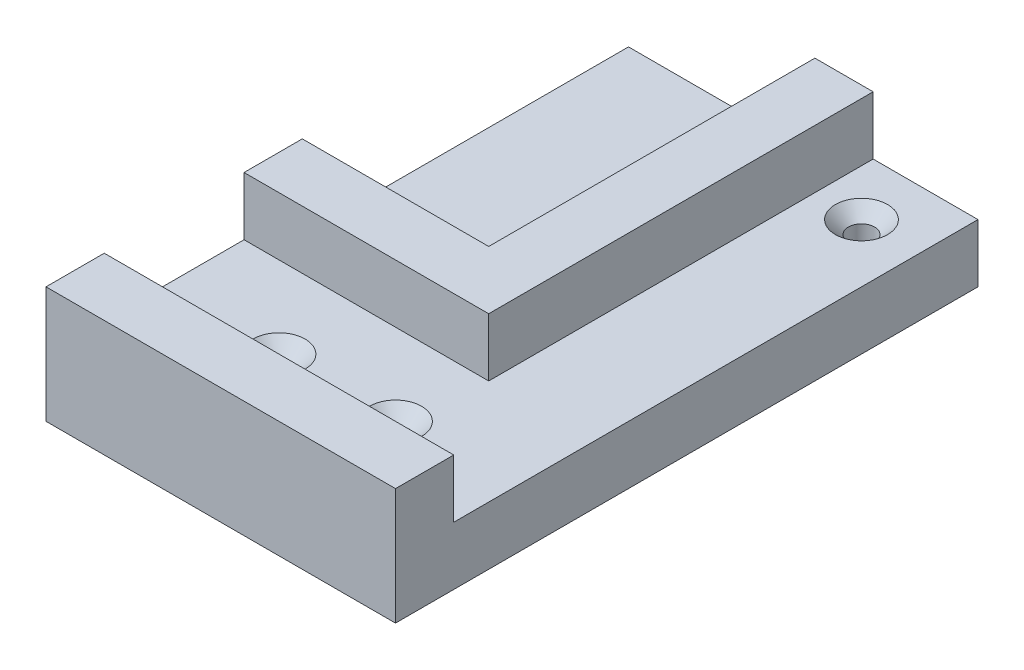
ISO-10303-21;
HEADER;
FILE_DESCRIPTION(('STEP AP214'),'2;1');
FILE_NAME('part.step','',(''),(''),'','','');
FILE_SCHEMA(('AUTOMOTIVE_DESIGN { 1 0 10303 214 1 1 1 1 }'));
ENDSEC;
DATA;
#1=APPLICATION_CONTEXT('core data for automotive mechanical design processes');
#2=APPLICATION_PROTOCOL_DEFINITION('international standard','automotive_design',2000,#1);
#3=PRODUCT_CONTEXT('',#1,'mechanical');
#4=PRODUCT('Part','Part','',(#3));
#5=PRODUCT_RELATED_PRODUCT_CATEGORY('part','',(#4));
#6=PRODUCT_DEFINITION_FORMATION('','',#4);
#7=PRODUCT_DEFINITION_CONTEXT('part definition',#1,'design');
#8=PRODUCT_DEFINITION('design','',#6,#7);
#9=PRODUCT_DEFINITION_SHAPE('','',#8);
#10=(LENGTH_UNIT() NAMED_UNIT(*) SI_UNIT(.MILLI.,.METRE.));
#11=(NAMED_UNIT(*) PLANE_ANGLE_UNIT() SI_UNIT($,.RADIAN.));
#12=(NAMED_UNIT(*) SI_UNIT($,.STERADIAN.) SOLID_ANGLE_UNIT());
#13=UNCERTAINTY_MEASURE_WITH_UNIT(LENGTH_MEASURE(1.E-05),#10,'distance_accuracy_value','');
#14=(GEOMETRIC_REPRESENTATION_CONTEXT(3) GLOBAL_UNCERTAINTY_ASSIGNED_CONTEXT((#13)) GLOBAL_UNIT_ASSIGNED_CONTEXT((#10,
#11,#12)) REPRESENTATION_CONTEXT('',''));
#15=CARTESIAN_POINT('',(0.,0.,0.));
#16=DIRECTION('',(0.,0.,1.));
#17=DIRECTION('',(1.,0.,0.));
#18=AXIS2_PLACEMENT_3D('',#15,#16,#17);
#19=CARTESIAN_POINT('',(-30.,20.,50.));
#20=DIRECTION('',(1.,0.,0.));
#21=DIRECTION('',(0.,0.,-1.));
#22=AXIS2_PLACEMENT_3D('',#19,#20,#21);
#23=PLANE('',#22);
#24=DIRECTION('',(0.,1.,0.));
#25=VECTOR('',#24,1.);
#26=CARTESIAN_POINT('',(-30.,10.,16.));
#27=LINE('',#26,#25);
#28=CARTESIAN_POINT('',(-30.,10.,16.));
#29=VERTEX_POINT('',#28);
#30=CARTESIAN_POINT('',(-30.,20.,16.));
#31=VERTEX_POINT('',#30);
#32=EDGE_CURVE('E180',#29,#31,#27,.T.);
#33=ORIENTED_EDGE('',*,*,#32,.T.);
#34=DIRECTION('',(0.,0.,1.));
#35=VECTOR('',#34,1.);
#36=CARTESIAN_POINT('',(-30.,20.,50.));
#37=LINE('',#36,#35);
#38=CARTESIAN_POINT('',(-30.,20.,6.));
#39=VERTEX_POINT('',#38);
#40=EDGE_CURVE('E202',#39,#31,#37,.T.);
#41=ORIENTED_EDGE('',*,*,#40,.F.);
#42=DIRECTION('',(0.,1.,0.));
#43=VECTOR('',#42,1.);
#44=CARTESIAN_POINT('',(-30.,5.675,6.));
#45=LINE('',#44,#43);
#46=CARTESIAN_POINT('',(-30.,5.675,6.));
#47=VERTEX_POINT('',#46);
#48=EDGE_CURVE('E63',#47,#39,#45,.T.);
#49=ORIENTED_EDGE('',*,*,#48,.F.);
#50=DIRECTION('',(0.,0.,1.));
#51=VECTOR('',#50,1.);
#52=CARTESIAN_POINT('',(-30.,5.675,-50.));
#53=LINE('',#52,#51);
#54=CARTESIAN_POINT('',(-30.,5.675,-50.));
#55=VERTEX_POINT('',#54);
#56=EDGE_CURVE('E161',#55,#47,#53,.T.);
#57=ORIENTED_EDGE('',*,*,#56,.F.);
#58=DIRECTION('',(0.,-1.,0.));
#59=VECTOR('',#58,1.);
#60=CARTESIAN_POINT('',(-30.,20.,-50.));
#61=LINE('',#60,#59);
#62=CARTESIAN_POINT('',(-30.,0.,-50.));
#63=VERTEX_POINT('',#62);
#64=EDGE_CURVE('E48',#55,#63,#61,.T.);
#65=ORIENTED_EDGE('',*,*,#64,.T.);
#66=DIRECTION('',(0.,0.,1.));
#67=VECTOR('',#66,1.);
#68=CARTESIAN_POINT('',(-30.,0.,50.));
#69=LINE('',#68,#67);
#70=CARTESIAN_POINT('',(-30.,0.,50.));
#71=VERTEX_POINT('',#70);
#72=EDGE_CURVE('E217',#63,#71,#69,.T.);
#73=ORIENTED_EDGE('',*,*,#72,.T.);
#74=DIRECTION('',(0.,-1.,0.));
#75=VECTOR('',#74,1.);
#76=CARTESIAN_POINT('',(-30.,20.,50.));
#77=LINE('',#76,#75);
#78=CARTESIAN_POINT('',(-30.,20.,50.));
#79=VERTEX_POINT('',#78);
#80=EDGE_CURVE('E225',#79,#71,#77,.T.);
#81=ORIENTED_EDGE('',*,*,#80,.F.);
#82=CARTESIAN_POINT('',(-30.,20.,40.));
#83=VERTEX_POINT('',#82);
#84=EDGE_CURVE('E150',#83,#79,#37,.T.);
#85=ORIENTED_EDGE('',*,*,#84,.F.);
#86=DIRECTION('',(0.,1.,0.));
#87=VECTOR('',#86,1.);
#88=CARTESIAN_POINT('',(-30.,10.,40.));
#89=LINE('',#88,#87);
#90=CARTESIAN_POINT('',(-30.,10.,40.));
#91=VERTEX_POINT('',#90);
#92=EDGE_CURVE('E55',#91,#83,#89,.T.);
#93=ORIENTED_EDGE('',*,*,#92,.F.);
#94=DIRECTION('',(0.,0.,1.));
#95=VECTOR('',#94,1.);
#96=CARTESIAN_POINT('',(-30.,10.,0.));
#97=LINE('',#96,#95);
#98=EDGE_CURVE('E136',#29,#91,#97,.T.);
#99=ORIENTED_EDGE('',*,*,#98,.F.);
#100=EDGE_LOOP('',(#33,#41,#49,#57,#65,#73,#81,#85,#93,#99));
#101=FACE_BOUND('',#100,.T.);
#102=ADVANCED_FACE('F39',(#101),#23,.F.);
#103=CARTESIAN_POINT('',(0.,20.,0.));
#104=DIRECTION('',(0.,-1.,0.));
#105=DIRECTION('',(0.,0.,-1.));
#106=AXIS2_PLACEMENT_3D('',#103,#104,#105);
#107=PLANE('',#106);
#108=DIRECTION('',(1.,0.,0.));
#109=VECTOR('',#108,1.);
#110=CARTESIAN_POINT('',(0.,20.,16.));
#111=LINE('',#110,#109);
#112=CARTESIAN_POINT('',(12.,20.,16.));
#113=VERTEX_POINT('',#112);
#114=EDGE_CURVE('E146',#31,#113,#111,.T.);
#115=ORIENTED_EDGE('',*,*,#114,.T.);
#116=DIRECTION('',(0.,0.,1.));
#117=VECTOR('',#116,1.);
#118=CARTESIAN_POINT('',(12.,20.,0.));
#119=LINE('',#118,#117);
#120=CARTESIAN_POINT('',(12.,20.,-50.));
#121=VERTEX_POINT('',#120);
#122=EDGE_CURVE('E267',#121,#113,#119,.T.);
#123=ORIENTED_EDGE('',*,*,#122,.F.);
#124=DIRECTION('',(-1.,0.,0.));
#125=VECTOR('',#124,1.);
#126=CARTESIAN_POINT('',(-30.,20.,-50.));
#127=LINE('',#126,#125);
#128=CARTESIAN_POINT('',(2.,20.,-50.));
#129=VERTEX_POINT('',#128);
#130=EDGE_CURVE('E198',#121,#129,#127,.T.);
#131=ORIENTED_EDGE('',*,*,#130,.T.);
#132=DIRECTION('',(0.,0.,-1.));
#133=VECTOR('',#132,1.);
#134=CARTESIAN_POINT('',(2.,20.,-50.));
#135=LINE('',#134,#133);
#136=CARTESIAN_POINT('',(2.00000000000001,20.,6.));
#137=VERTEX_POINT('',#136);
#138=EDGE_CURVE('E166',#137,#129,#135,.T.);
#139=ORIENTED_EDGE('',*,*,#138,.F.);
#140=DIRECTION('',(1.,0.,0.));
#141=VECTOR('',#140,1.);
#142=CARTESIAN_POINT('',(-30.,20.,6.));
#143=LINE('',#142,#141);
#144=EDGE_CURVE('E177',#39,#137,#143,.T.);
#145=ORIENTED_EDGE('',*,*,#144,.F.);
#146=ORIENTED_EDGE('',*,*,#40,.T.);
#147=EDGE_LOOP('',(#115,#123,#131,#139,#145,#146));
#148=FACE_BOUND('',#147,.T.);
#149=ADVANCED_FACE('F343',(#148),#107,.F.);
#150=CARTESIAN_POINT('',(30.,20.,50.));
#151=DIRECTION('',(-1.,0.,0.));
#152=DIRECTION('',(0.,0.,1.));
#153=AXIS2_PLACEMENT_3D('',#150,#151,#152);
#154=PLANE('',#153);
#155=DIRECTION('',(0.,0.,-1.));
#156=VECTOR('',#155,1.);
#157=CARTESIAN_POINT('',(30.,10.,0.));
#158=LINE('',#157,#156);
#159=CARTESIAN_POINT('',(30.,10.,40.));
#160=VERTEX_POINT('',#159);
#161=CARTESIAN_POINT('',(30.,10.,-50.));
#162=VERTEX_POINT('',#161);
#163=EDGE_CURVE('E135',#160,#162,#158,.T.);
#164=ORIENTED_EDGE('',*,*,#163,.F.);
#165=DIRECTION('',(0.,1.,0.));
#166=VECTOR('',#165,1.);
#167=CARTESIAN_POINT('',(30.,10.,40.));
#168=LINE('',#167,#166);
#169=CARTESIAN_POINT('',(30.,20.,40.));
#170=VERTEX_POINT('',#169);
#171=EDGE_CURVE('E131',#160,#170,#168,.T.);
#172=ORIENTED_EDGE('',*,*,#171,.T.);
#173=DIRECTION('',(0.,0.,-1.));
#174=VECTOR('',#173,1.);
#175=CARTESIAN_POINT('',(30.,20.,50.));
#176=LINE('',#175,#174);
#177=CARTESIAN_POINT('',(30.,20.,50.));
#178=VERTEX_POINT('',#177);
#179=EDGE_CURVE('E194',#178,#170,#176,.T.);
#180=ORIENTED_EDGE('',*,*,#179,.F.);
#181=DIRECTION('',(0.,-1.,0.));
#182=VECTOR('',#181,1.);
#183=CARTESIAN_POINT('',(30.,20.,50.));
#184=LINE('',#183,#182);
#185=CARTESIAN_POINT('',(30.,0.,50.));
#186=VERTEX_POINT('',#185);
#187=EDGE_CURVE('E209',#178,#186,#184,.T.);
#188=ORIENTED_EDGE('',*,*,#187,.T.);
#189=DIRECTION('',(0.,0.,-1.));
#190=VECTOR('',#189,1.);
#191=CARTESIAN_POINT('',(30.,0.,50.));
#192=LINE('',#191,#190);
#193=CARTESIAN_POINT('',(30.,0.,-50.));
#194=VERTEX_POINT('',#193);
#195=EDGE_CURVE('E188',#186,#194,#192,.T.);
#196=ORIENTED_EDGE('',*,*,#195,.T.);
#197=DIRECTION('',(0.,-1.,0.));
#198=VECTOR('',#197,1.);
#199=CARTESIAN_POINT('',(30.,20.,-50.));
#200=LINE('',#199,#198);
#201=EDGE_CURVE('E11',#162,#194,#200,.T.);
#202=ORIENTED_EDGE('',*,*,#201,.F.);
#203=EDGE_LOOP('',(#164,#172,#180,#188,#196,#202));
#204=FACE_BOUND('',#203,.T.);
#205=ADVANCED_FACE('F41',(#204),#154,.F.);
#206=CARTESIAN_POINT('',(-30.,20.,-50.));
#207=DIRECTION('',(0.,0.,1.));
#208=DIRECTION('',(1.,0.,0.));
#209=AXIS2_PLACEMENT_3D('',#206,#207,#208);
#210=PLANE('',#209);
#211=ORIENTED_EDGE('',*,*,#130,.F.);
#212=DIRECTION('',(0.,1.,0.));
#213=VECTOR('',#212,1.);
#214=CARTESIAN_POINT('',(12.,10.,-50.));
#215=LINE('',#214,#213);
#216=CARTESIAN_POINT('',(12.,10.,-50.));
#217=VERTEX_POINT('',#216);
#218=EDGE_CURVE('E155',#217,#121,#215,.T.);
#219=ORIENTED_EDGE('',*,*,#218,.F.);
#220=DIRECTION('',(-1.,0.,0.));
#221=VECTOR('',#220,1.);
#222=CARTESIAN_POINT('',(0.,10.,-50.));
#223=LINE('',#222,#221);
#224=EDGE_CURVE('E275',#162,#217,#223,.T.);
#225=ORIENTED_EDGE('',*,*,#224,.F.);
#226=ORIENTED_EDGE('',*,*,#201,.T.);
#227=DIRECTION('',(-1.,0.,0.));
#228=VECTOR('',#227,1.);
#229=CARTESIAN_POINT('',(-30.,0.,-50.));
#230=LINE('',#229,#228);
#231=EDGE_CURVE('E213',#194,#63,#230,.T.);
#232=ORIENTED_EDGE('',*,*,#231,.T.);
#233=ORIENTED_EDGE('',*,*,#64,.F.);
#234=DIRECTION('',(-1.,0.,0.));
#235=VECTOR('',#234,1.);
#236=CARTESIAN_POINT('',(-30.,5.675,-50.));
#237=LINE('',#236,#235);
#238=CARTESIAN_POINT('',(2.,5.675,-50.));
#239=VERTEX_POINT('',#238);
#240=EDGE_CURVE('E174',#239,#55,#237,.T.);
#241=ORIENTED_EDGE('',*,*,#240,.F.);
#242=DIRECTION('',(0.,1.,0.));
#243=VECTOR('',#242,1.);
#244=CARTESIAN_POINT('',(2.,5.675,-50.));
#245=LINE('',#244,#243);
#246=EDGE_CURVE('E184',#239,#129,#245,.T.);
#247=ORIENTED_EDGE('',*,*,#246,.T.);
#248=EDGE_LOOP('',(#211,#219,#225,#226,#232,#233,#241,#247));
#249=FACE_BOUND('',#248,.T.);
#250=ADVANCED_FACE('F236',(#249),#210,.F.);
#251=CARTESIAN_POINT('',(-30.,20.,50.));
#252=DIRECTION('',(0.,0.,-1.));
#253=DIRECTION('',(-1.,0.,0.));
#254=AXIS2_PLACEMENT_3D('',#251,#252,#253);
#255=PLANE('',#254);
#256=DIRECTION('',(1.,0.,0.));
#257=VECTOR('',#256,1.);
#258=CARTESIAN_POINT('',(-30.,0.,50.));
#259=LINE('',#258,#257);
#260=EDGE_CURVE('E199',#71,#186,#259,.T.);
#261=ORIENTED_EDGE('',*,*,#260,.T.);
#262=ORIENTED_EDGE('',*,*,#187,.F.);
#263=DIRECTION('',(1.,0.,0.));
#264=VECTOR('',#263,1.);
#265=CARTESIAN_POINT('',(-30.,20.,50.));
#266=LINE('',#265,#264);
#267=EDGE_CURVE('E206',#79,#178,#266,.T.);
#268=ORIENTED_EDGE('',*,*,#267,.F.);
#269=ORIENTED_EDGE('',*,*,#80,.T.);
#270=EDGE_LOOP('',(#261,#262,#268,#269));
#271=FACE_BOUND('',#270,.T.);
#272=ADVANCED_FACE('F245',(#271),#255,.F.);
#273=ORIENTED_EDGE('',*,*,#179,.T.);
#274=DIRECTION('',(1.,0.,0.));
#275=VECTOR('',#274,1.);
#276=CARTESIAN_POINT('',(0.,20.,40.));
#277=LINE('',#276,#275);
#278=EDGE_CURVE('E251',#83,#170,#277,.T.);
#279=ORIENTED_EDGE('',*,*,#278,.F.);
#280=ORIENTED_EDGE('',*,*,#84,.T.);
#281=ORIENTED_EDGE('',*,*,#267,.T.);
#282=EDGE_LOOP('',(#273,#279,#280,#281));
#283=FACE_BOUND('',#282,.T.);
#284=ADVANCED_FACE('F250',(#283),#107,.F.);
#285=CARTESIAN_POINT('',(0.,0.,0.));
#286=DIRECTION('',(0.,-1.,0.));
#287=DIRECTION('',(0.,0.,-1.));
#288=AXIS2_PLACEMENT_3D('',#285,#286,#287);
#289=PLANE('',#288);
#290=CARTESIAN_POINT('',(20.,0.,-40.));
#291=DIRECTION('',(0.,1.,0.));
#292=DIRECTION('',(0.,0.,1.));
#293=AXIS2_PLACEMENT_3D('',#290,#291,#292);
#294=CIRCLE('',#293,2.24999999999999);
#295=CARTESIAN_POINT('',(20.,0.,-37.75));
#296=VERTEX_POINT('',#295);
#297=EDGE_CURVE('E304',#296,#296,#294,.T.);
#298=ORIENTED_EDGE('',*,*,#297,.T.);
#299=EDGE_LOOP('',(#298));
#300=FACE_BOUND('',#299,.T.);
#301=CARTESIAN_POINT('',(9.99999999999999,0.,30.));
#302=DIRECTION('',(0.,1.,0.));
#303=DIRECTION('',(0.,0.,1.));
#304=AXIS2_PLACEMENT_3D('',#301,#302,#303);
#305=CIRCLE('',#304,2.24999999999999);
#306=CARTESIAN_POINT('',(9.99999999999999,0.,32.25));
#307=VERTEX_POINT('',#306);
#308=EDGE_CURVE('E292',#307,#307,#305,.T.);
#309=ORIENTED_EDGE('',*,*,#308,.T.);
#310=EDGE_LOOP('',(#309));
#311=FACE_BOUND('',#310,.T.);
#312=CARTESIAN_POINT('',(-10.,0.,30.));
#313=DIRECTION('',(0.,1.,0.));
#314=DIRECTION('',(0.,0.,1.));
#315=AXIS2_PLACEMENT_3D('',#312,#313,#314);
#316=CIRCLE('',#315,2.24999999999999);
#317=CARTESIAN_POINT('',(-10.,0.,32.25));
#318=VERTEX_POINT('',#317);
#319=EDGE_CURVE('E271',#318,#318,#316,.T.);
#320=ORIENTED_EDGE('',*,*,#319,.T.);
#321=EDGE_LOOP('',(#320));
#322=FACE_BOUND('',#321,.T.);
#323=ORIENTED_EDGE('',*,*,#195,.F.);
#324=ORIENTED_EDGE('',*,*,#260,.F.);
#325=ORIENTED_EDGE('',*,*,#72,.F.);
#326=ORIENTED_EDGE('',*,*,#231,.F.);
#327=EDGE_LOOP('',(#323,#324,#325,#326));
#328=FACE_BOUND('',#327,.T.);
#329=ADVANCED_FACE('F242',(#300,#311,#322,#328),#289,.T.);
#330=CARTESIAN_POINT('',(2.,5.675,-50.));
#331=DIRECTION('',(1.,0.,0.));
#332=DIRECTION('',(0.,0.,-1.));
#333=AXIS2_PLACEMENT_3D('',#330,#331,#332);
#334=PLANE('',#333);
#335=ORIENTED_EDGE('',*,*,#138,.T.);
#336=ORIENTED_EDGE('',*,*,#246,.F.);
#337=DIRECTION('',(0.,0.,-1.));
#338=VECTOR('',#337,1.);
#339=CARTESIAN_POINT('',(2.,5.675,-50.));
#340=LINE('',#339,#338);
#341=CARTESIAN_POINT('',(2.00000000000001,5.675,6.));
#342=VERTEX_POINT('',#341);
#343=EDGE_CURVE('E170',#342,#239,#340,.T.);
#344=ORIENTED_EDGE('',*,*,#343,.F.);
#345=DIRECTION('',(0.,1.,0.));
#346=VECTOR('',#345,1.);
#347=CARTESIAN_POINT('',(2.00000000000001,5.675,6.));
#348=LINE('',#347,#346);
#349=EDGE_CURVE('E189',#342,#137,#348,.T.);
#350=ORIENTED_EDGE('',*,*,#349,.T.);
#351=EDGE_LOOP('',(#335,#336,#344,#350));
#352=FACE_BOUND('',#351,.T.);
#353=ADVANCED_FACE('F390',(#352),#334,.F.);
#354=CARTESIAN_POINT('',(-30.,5.675,6.));
#355=DIRECTION('',(0.,0.,1.));
#356=DIRECTION('',(1.,0.,0.));
#357=AXIS2_PLACEMENT_3D('',#354,#355,#356);
#358=PLANE('',#357);
#359=ORIENTED_EDGE('',*,*,#144,.T.);
#360=ORIENTED_EDGE('',*,*,#349,.F.);
#361=DIRECTION('',(1.,0.,0.));
#362=VECTOR('',#361,1.);
#363=CARTESIAN_POINT('',(-30.,5.675,6.));
#364=LINE('',#363,#362);
#365=EDGE_CURVE('E165',#47,#342,#364,.T.);
#366=ORIENTED_EDGE('',*,*,#365,.F.);
#367=ORIENTED_EDGE('',*,*,#48,.T.);
#368=EDGE_LOOP('',(#359,#360,#366,#367));
#369=FACE_BOUND('',#368,.T.);
#370=ADVANCED_FACE('F379',(#369),#358,.F.);
#371=CARTESIAN_POINT('',(0.,5.675,0.));
#372=DIRECTION('',(0.,1.,0.));
#373=DIRECTION('',(0.,0.,1.));
#374=AXIS2_PLACEMENT_3D('',#371,#372,#373);
#375=PLANE('',#374);
#376=ORIENTED_EDGE('',*,*,#56,.T.);
#377=ORIENTED_EDGE('',*,*,#365,.T.);
#378=ORIENTED_EDGE('',*,*,#343,.T.);
#379=ORIENTED_EDGE('',*,*,#240,.T.);
#380=EDGE_LOOP('',(#376,#377,#378,#379));
#381=FACE_BOUND('',#380,.T.);
#382=ADVANCED_FACE('F374',(#381),#375,.T.);
#383=CARTESIAN_POINT('',(0.,10.,16.));
#384=DIRECTION('',(0.,0.,1.));
#385=DIRECTION('',(1.,0.,0.));
#386=AXIS2_PLACEMENT_3D('',#383,#384,#385);
#387=PLANE('',#386);
#388=ORIENTED_EDGE('',*,*,#114,.F.);
#389=ORIENTED_EDGE('',*,*,#32,.F.);
#390=DIRECTION('',(1.,0.,0.));
#391=VECTOR('',#390,1.);
#392=CARTESIAN_POINT('',(0.,10.,16.));
#393=LINE('',#392,#391);
#394=CARTESIAN_POINT('',(12.,10.,16.));
#395=VERTEX_POINT('',#394);
#396=EDGE_CURVE('E142',#29,#395,#393,.T.);
#397=ORIENTED_EDGE('',*,*,#396,.T.);
#398=DIRECTION('',(0.,1.,0.));
#399=VECTOR('',#398,1.);
#400=CARTESIAN_POINT('',(12.,10.,16.));
#401=LINE('',#400,#399);
#402=EDGE_CURVE('E255',#395,#113,#401,.T.);
#403=ORIENTED_EDGE('',*,*,#402,.T.);
#404=EDGE_LOOP('',(#388,#389,#397,#403));
#405=FACE_BOUND('',#404,.T.);
#406=ADVANCED_FACE('F378',(#405),#387,.T.);
#407=CARTESIAN_POINT('',(12.,10.,0.));
#408=DIRECTION('',(-1.,0.,0.));
#409=DIRECTION('',(0.,0.,1.));
#410=AXIS2_PLACEMENT_3D('',#407,#408,#409);
#411=PLANE('',#410);
#412=ORIENTED_EDGE('',*,*,#122,.T.);
#413=ORIENTED_EDGE('',*,*,#402,.F.);
#414=DIRECTION('',(0.,0.,1.));
#415=VECTOR('',#414,1.);
#416=CARTESIAN_POINT('',(12.,10.,0.));
#417=LINE('',#416,#415);
#418=EDGE_CURVE('E157',#217,#395,#417,.T.);
#419=ORIENTED_EDGE('',*,*,#418,.F.);
#420=ORIENTED_EDGE('',*,*,#218,.T.);
#421=EDGE_LOOP('',(#412,#413,#419,#420));
#422=FACE_BOUND('',#421,.T.);
#423=ADVANCED_FACE('F492',(#422),#411,.F.);
#424=CARTESIAN_POINT('',(0.,10.,40.));
#425=DIRECTION('',(0.,0.,1.));
#426=DIRECTION('',(1.,0.,0.));
#427=AXIS2_PLACEMENT_3D('',#424,#425,#426);
#428=PLANE('',#427);
#429=ORIENTED_EDGE('',*,*,#278,.T.);
#430=ORIENTED_EDGE('',*,*,#171,.F.);
#431=DIRECTION('',(1.,0.,0.));
#432=VECTOR('',#431,1.);
#433=CARTESIAN_POINT('',(0.,10.,40.));
#434=LINE('',#433,#432);
#435=EDGE_CURVE('E127',#91,#160,#434,.T.);
#436=ORIENTED_EDGE('',*,*,#435,.F.);
#437=ORIENTED_EDGE('',*,*,#92,.T.);
#438=EDGE_LOOP('',(#429,#430,#436,#437));
#439=FACE_BOUND('',#438,.T.);
#440=ADVANCED_FACE('F129',(#439),#428,.F.);
#441=CARTESIAN_POINT('',(0.,10.,0.));
#442=DIRECTION('',(0.,1.,0.));
#443=DIRECTION('',(0.,0.,1.));
#444=AXIS2_PLACEMENT_3D('',#441,#442,#443);
#445=PLANE('',#444);
#446=CARTESIAN_POINT('',(20.,10.,-40.));
#447=DIRECTION('',(0.,1.,0.));
#448=DIRECTION('',(0.,0.,1.));
#449=AXIS2_PLACEMENT_3D('',#446,#447,#448);
#450=CIRCLE('',#449,4.48);
#451=CARTESIAN_POINT('',(20.,10.,-35.52));
#452=VERTEX_POINT('',#451);
#453=EDGE_CURVE('E312',#452,#452,#450,.T.);
#454=ORIENTED_EDGE('',*,*,#453,.F.);
#455=EDGE_LOOP('',(#454));
#456=FACE_BOUND('',#455,.T.);
#457=CARTESIAN_POINT('',(9.99999999999999,10.,30.));
#458=DIRECTION('',(0.,1.,0.));
#459=DIRECTION('',(0.,0.,1.));
#460=AXIS2_PLACEMENT_3D('',#457,#458,#459);
#461=CIRCLE('',#460,4.48);
#462=CARTESIAN_POINT('',(9.99999999999999,10.,34.48));
#463=VERTEX_POINT('',#462);
#464=EDGE_CURVE('E300',#463,#463,#461,.T.);
#465=ORIENTED_EDGE('',*,*,#464,.F.);
#466=EDGE_LOOP('',(#465));
#467=FACE_BOUND('',#466,.T.);
#468=CARTESIAN_POINT('',(-10.,10.,30.));
#469=DIRECTION('',(0.,1.,0.));
#470=DIRECTION('',(0.,0.,1.));
#471=AXIS2_PLACEMENT_3D('',#468,#469,#470);
#472=CIRCLE('',#471,4.48);
#473=CARTESIAN_POINT('',(-10.,10.,34.48));
#474=VERTEX_POINT('',#473);
#475=EDGE_CURVE('E288',#474,#474,#472,.T.);
#476=ORIENTED_EDGE('',*,*,#475,.F.);
#477=EDGE_LOOP('',(#476));
#478=FACE_BOUND('',#477,.T.);
#479=ORIENTED_EDGE('',*,*,#98,.T.);
#480=ORIENTED_EDGE('',*,*,#435,.T.);
#481=ORIENTED_EDGE('',*,*,#163,.T.);
#482=ORIENTED_EDGE('',*,*,#224,.T.);
#483=ORIENTED_EDGE('',*,*,#418,.T.);
#484=ORIENTED_EDGE('',*,*,#396,.F.);
#485=EDGE_LOOP('',(#479,#480,#481,#482,#483,#484));
#486=FACE_BOUND('',#485,.T.);
#487=ADVANCED_FACE('F140',(#456,#467,#478,#486),#445,.T.);
#488=CARTESIAN_POINT('',(-10.,10.,30.));
#489=DIRECTION('',(0.,1.,0.));
#490=DIRECTION('',(0.,0.,1.));
#491=AXIS2_PLACEMENT_3D('',#488,#489,#490);
#492=CYLINDRICAL_SURFACE('',#491,2.24999999999999);
#493=ORIENTED_EDGE('',*,*,#319,.F.);
#494=EDGE_LOOP('',(#493));
#495=FACE_BOUND('',#494,.T.);
#496=CARTESIAN_POINT('',(-10.,7.76999999999999,30.));
#497=DIRECTION('',(0.,1.,0.));
#498=DIRECTION('',(0.,0.,1.));
#499=AXIS2_PLACEMENT_3D('',#496,#497,#498);
#500=CIRCLE('',#499,2.24999999999999);
#501=CARTESIAN_POINT('',(-10.,7.76999999999999,32.25));
#502=VERTEX_POINT('',#501);
#503=EDGE_CURVE('E284',#502,#502,#500,.T.);
#504=ORIENTED_EDGE('',*,*,#503,.T.);
#505=EDGE_LOOP('',(#504));
#506=FACE_BOUND('',#505,.T.);
#507=ADVANCED_FACE('F321',(#495,#506),#492,.F.);
#508=CARTESIAN_POINT('',(-10.,10.,30.));
#509=DIRECTION('',(0.,1.,0.));
#510=DIRECTION('',(0.,0.,1.));
#511=AXIS2_PLACEMENT_3D('',#508,#509,#510);
#512=CONICAL_SURFACE('',#511,4.48,0.785398163397449);
#513=ORIENTED_EDGE('',*,*,#503,.F.);
#514=EDGE_LOOP('',(#513));
#515=FACE_BOUND('',#514,.T.);
#516=ORIENTED_EDGE('',*,*,#475,.T.);
#517=EDGE_LOOP('',(#516));
#518=FACE_BOUND('',#517,.T.);
#519=ADVANCED_FACE('F327',(#515,#518),#512,.F.);
#520=CARTESIAN_POINT('',(9.99999999999999,10.,30.));
#521=DIRECTION('',(0.,1.,0.));
#522=DIRECTION('',(0.,0.,1.));
#523=AXIS2_PLACEMENT_3D('',#520,#521,#522);
#524=CYLINDRICAL_SURFACE('',#523,2.24999999999999);
#525=ORIENTED_EDGE('',*,*,#308,.F.);
#526=EDGE_LOOP('',(#525));
#527=FACE_BOUND('',#526,.T.);
#528=CARTESIAN_POINT('',(9.99999999999999,7.76999999999999,30.));
#529=DIRECTION('',(0.,1.,0.));
#530=DIRECTION('',(0.,0.,1.));
#531=AXIS2_PLACEMENT_3D('',#528,#529,#530);
#532=CIRCLE('',#531,2.24999999999999);
#533=CARTESIAN_POINT('',(9.99999999999999,7.76999999999999,32.25));
#534=VERTEX_POINT('',#533);
#535=EDGE_CURVE('E296',#534,#534,#532,.T.);
#536=ORIENTED_EDGE('',*,*,#535,.T.);
#537=EDGE_LOOP('',(#536));
#538=FACE_BOUND('',#537,.T.);
#539=ADVANCED_FACE('F329',(#527,#538),#524,.F.);
#540=CARTESIAN_POINT('',(9.99999999999999,10.,30.));
#541=DIRECTION('',(0.,1.,0.));
#542=DIRECTION('',(0.,0.,1.));
#543=AXIS2_PLACEMENT_3D('',#540,#541,#542);
#544=CONICAL_SURFACE('',#543,4.48,0.785398163397449);
#545=ORIENTED_EDGE('',*,*,#535,.F.);
#546=EDGE_LOOP('',(#545));
#547=FACE_BOUND('',#546,.T.);
#548=ORIENTED_EDGE('',*,*,#464,.T.);
#549=EDGE_LOOP('',(#548));
#550=FACE_BOUND('',#549,.T.);
#551=ADVANCED_FACE('F336',(#547,#550),#544,.F.);
#552=CARTESIAN_POINT('',(20.,10.,-40.));
#553=DIRECTION('',(0.,1.,0.));
#554=DIRECTION('',(0.,0.,1.));
#555=AXIS2_PLACEMENT_3D('',#552,#553,#554);
#556=CYLINDRICAL_SURFACE('',#555,2.24999999999999);
#557=ORIENTED_EDGE('',*,*,#297,.F.);
#558=EDGE_LOOP('',(#557));
#559=FACE_BOUND('',#558,.T.);
#560=CARTESIAN_POINT('',(20.,7.76999999999999,-40.));
#561=DIRECTION('',(0.,1.,0.));
#562=DIRECTION('',(0.,0.,1.));
#563=AXIS2_PLACEMENT_3D('',#560,#561,#562);
#564=CIRCLE('',#563,2.24999999999999);
#565=CARTESIAN_POINT('',(20.,7.76999999999999,-37.75));
#566=VERTEX_POINT('',#565);
#567=EDGE_CURVE('E308',#566,#566,#564,.T.);
#568=ORIENTED_EDGE('',*,*,#567,.T.);
#569=EDGE_LOOP('',(#568));
#570=FACE_BOUND('',#569,.T.);
#571=ADVANCED_FACE('F456',(#559,#570),#556,.F.);
#572=CARTESIAN_POINT('',(20.,10.,-40.));
#573=DIRECTION('',(0.,1.,0.));
#574=DIRECTION('',(0.,0.,1.));
#575=AXIS2_PLACEMENT_3D('',#572,#573,#574);
#576=CONICAL_SURFACE('',#575,4.48,0.785398163397449);
#577=ORIENTED_EDGE('',*,*,#567,.F.);
#578=EDGE_LOOP('',(#577));
#579=FACE_BOUND('',#578,.T.);
#580=ORIENTED_EDGE('',*,*,#453,.T.);
#581=EDGE_LOOP('',(#580));
#582=FACE_BOUND('',#581,.T.);
#583=ADVANCED_FACE('F317',(#579,#582),#576,.F.);
#584=CLOSED_SHELL('',(#102,#149,#205,#250,#272,#284,#329,#353,#370,#382,#406,#423,#440,#487,
#507,#519,#539,#551,#571,#583));
#585=MANIFOLD_SOLID_BREP('B2',#584);
#586=ADVANCED_BREP_SHAPE_REPRESENTATION('',(#18,#585),#14);
#587=SHAPE_DEFINITION_REPRESENTATION(#9,#586);
ENDSEC;
END-ISO-10303-21;
